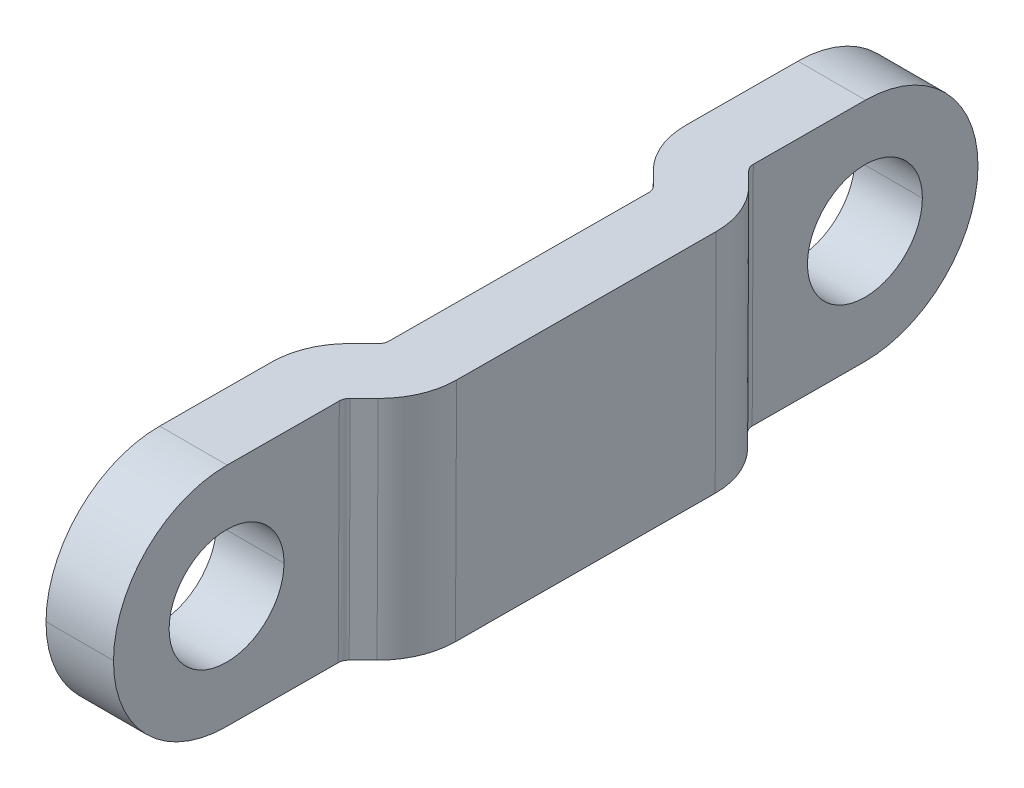
ISO-10303-21;
HEADER;
FILE_DESCRIPTION(('STEP AP214'),'2;1');
FILE_NAME('part.step','',(''),(''),'','','');
FILE_SCHEMA(('AUTOMOTIVE_DESIGN { 1 0 10303 214 1 1 1 1 }'));
ENDSEC;
DATA;
#1=APPLICATION_CONTEXT('core data for automotive mechanical design processes');
#2=APPLICATION_PROTOCOL_DEFINITION('international standard','automotive_design',2000,#1);
#3=PRODUCT_CONTEXT('',#1,'mechanical');
#4=PRODUCT('Part','Part','',(#3));
#5=PRODUCT_RELATED_PRODUCT_CATEGORY('part','',(#4));
#6=PRODUCT_DEFINITION_FORMATION('','',#4);
#7=PRODUCT_DEFINITION_CONTEXT('part definition',#1,'design');
#8=PRODUCT_DEFINITION('design','',#6,#7);
#9=PRODUCT_DEFINITION_SHAPE('','',#8);
#10=(LENGTH_UNIT() NAMED_UNIT(*) SI_UNIT(.MILLI.,.METRE.));
#11=(NAMED_UNIT(*) PLANE_ANGLE_UNIT() SI_UNIT($,.RADIAN.));
#12=(NAMED_UNIT(*) SI_UNIT($,.STERADIAN.) SOLID_ANGLE_UNIT());
#13=UNCERTAINTY_MEASURE_WITH_UNIT(LENGTH_MEASURE(1.E-05),#10,'distance_accuracy_value','');
#14=(GEOMETRIC_REPRESENTATION_CONTEXT(3) GLOBAL_UNCERTAINTY_ASSIGNED_CONTEXT((#13)) GLOBAL_UNIT_ASSIGNED_CONTEXT((#10,
#11,#12)) REPRESENTATION_CONTEXT('',''));
#15=CARTESIAN_POINT('',(0.,0.,0.));
#16=DIRECTION('',(0.,0.,1.));
#17=DIRECTION('',(1.,0.,0.));
#18=AXIS2_PLACEMENT_3D('',#15,#16,#17);
#19=CARTESIAN_POINT('',(13.3985,7.69566808738572,33.1730499954914));
#20=DIRECTION('',(0.,-0.999988166260955,0.00486490884316564));
#21=DIRECTION('',(-1.,0.,0.));
#22=AXIS2_PLACEMENT_3D('',#19,#20,#21);
#23=CYLINDRICAL_SURFACE('',#22,5.461);
#24=DIRECTION('',(0.,0.999988166260955,-0.00486490884316548));
#25=VECTOR('',#24,1.);
#26=CARTESIAN_POINT('',(9.53698986794027,-8.03335966010237,37.1111270159101));
#27=LINE('',#26,#25);
#28=CARTESIAN_POINT('',(9.53698986794024,-8.03335966010237,37.1111270159101));
#29=VERTEX_POINT('',#28);
#30=CARTESIAN_POINT('',(9.53698986794027,7.71445398217515,37.034514431448));
#31=VERTEX_POINT('',#30);
#32=EDGE_CURVE('E11',#29,#31,#27,.T.);
#33=ORIENTED_EDGE('',*,*,#32,.T.);
#34=CARTESIAN_POINT('',(13.3985,7.69566808738572,33.1730499954914));
#35=DIRECTION('',(0.,0.999988166260955,-0.00486490884316564));
#36=DIRECTION('',(-1.,0.,0.));
#37=AXIS2_PLACEMENT_3D('',#34,#35,#36);
#38=CIRCLE('',#37,5.461);
#39=CARTESIAN_POINT('',(7.9375,7.69566808738571,33.1730499954915));
#40=VERTEX_POINT('',#39);
#41=EDGE_CURVE('E315',#40,#31,#38,.T.);
#42=ORIENTED_EDGE('',*,*,#41,.F.);
#43=DIRECTION('',(0.,-0.999988166260955,0.00486490884316592));
#44=VECTOR('',#43,1.);
#45=CARTESIAN_POINT('',(7.93750000000001,7.69566808738572,33.1730499954914));
#46=LINE('',#45,#44);
#47=CARTESIAN_POINT('',(7.9375,-8.0521455548918,33.2496625799536));
#48=VERTEX_POINT('',#47);
#49=EDGE_CURVE('E261',#40,#48,#46,.T.);
#50=ORIENTED_EDGE('',*,*,#49,.T.);
#51=CARTESIAN_POINT('',(13.3985,-8.05214555489179,33.2496625799536));
#52=DIRECTION('',(0.,-0.999988166260955,0.00486490884316564));
#53=DIRECTION('',(-0.707106781186565,0.00344001003285669,0.707098413469405));
#54=AXIS2_PLACEMENT_3D('',#51,#52,#53);
#55=CIRCLE('',#54,5.461);
#56=EDGE_CURVE('E217',#29,#48,#55,.T.);
#57=ORIENTED_EDGE('',*,*,#56,.F.);
#58=EDGE_LOOP('',(#33,#42,#50,#57));
#59=FACE_BOUND('',#58,.T.);
#60=ADVANCED_FACE('F17',(#59),#23,.T.);
#61=CARTESIAN_POINT('',(9.53698986794027,7.71445398217515,37.034514431448));
#62=DIRECTION('',(0.707106781186548,-0.00344001003285683,-0.707098413469422));
#63=DIRECTION('',(-0.707106781186548,-0.00344001003285683,-0.707098413469422));
#64=AXIS2_PLACEMENT_3D('',#61,#62,#63);
#65=PLANE('',#64);
#66=DIRECTION('',(0.,-0.999988166260955,0.00486490884316592));
#67=VECTOR('',#66,1.);
#68=CARTESIAN_POINT('',(10.5083153672642,7.7191793921864,38.0058284363594));
#69=LINE('',#68,#67);
#70=CARTESIAN_POINT('',(10.5083153672641,7.7191793921864,38.0058284363593));
#71=VERTEX_POINT('',#70);
#72=CARTESIAN_POINT('',(10.5083153672641,-8.02863425009112,38.0824410208215));
#73=VERTEX_POINT('',#72);
#74=EDGE_CURVE('E24',#71,#73,#69,.T.);
#75=ORIENTED_EDGE('',*,*,#74,.F.);
#76=DIRECTION('',(0.707106781186549,0.00344001003285638,0.707098413469421));
#77=VECTOR('',#76,1.);
#78=CARTESIAN_POINT('',(9.53698986794027,7.71445398217515,37.034514431448));
#79=LINE('',#78,#77);
#80=EDGE_CURVE('E312',#31,#71,#79,.T.);
#81=ORIENTED_EDGE('',*,*,#80,.F.);
#82=ORIENTED_EDGE('',*,*,#32,.F.);
#83=DIRECTION('',(-0.707106781186549,-0.00344001003285672,-0.707098413469421));
#84=VECTOR('',#83,1.);
#85=CARTESIAN_POINT('',(10.5083153672641,-8.02863425009112,38.0824410208214));
#86=LINE('',#85,#84);
#87=EDGE_CURVE('E220',#73,#29,#86,.T.);
#88=ORIENTED_EDGE('',*,*,#87,.F.);
#89=EDGE_LOOP('',(#75,#81,#82,#88));
#90=FACE_BOUND('',#89,.T.);
#91=ADVANCED_FACE('F405',(#90),#65,.F.);
#92=CARTESIAN_POINT('',(9.96950000000001,7.72180067983144,38.5446374274231));
#93=DIRECTION('',(0.,-0.999988166260955,0.00486490884316564));
#94=DIRECTION('',(-1.,0.,0.));
#95=AXIS2_PLACEMENT_3D('',#92,#93,#94);
#96=CYLINDRICAL_SURFACE('',#95,0.762000000000002);
#97=DIRECTION('',(0.,0.999988166260955,-0.00486490884316592));
#98=VECTOR('',#97,1.);
#99=CARTESIAN_POINT('',(10.7315,-8.02601296244607,38.6212500118852));
#100=LINE('',#99,#98);
#101=CARTESIAN_POINT('',(10.7315,-8.02601296244608,38.6212500118852));
#102=VERTEX_POINT('',#101);
#103=CARTESIAN_POINT('',(10.7315,7.72180067983144,38.544637427423));
#104=VERTEX_POINT('',#103);
#105=EDGE_CURVE('E387',#102,#104,#100,.T.);
#106=ORIENTED_EDGE('',*,*,#105,.T.);
#107=CARTESIAN_POINT('',(9.96950000000001,7.72180067983144,38.5446374274231));
#108=DIRECTION('',(0.,-0.999988166260955,0.00486490884316564));
#109=DIRECTION('',(0.707106781186434,-0.00344001003285763,-0.707098413469536));
#110=AXIS2_PLACEMENT_3D('',#107,#108,#109);
#111=CIRCLE('',#110,0.762000000000002);
#112=EDGE_CURVE('E309',#71,#104,#111,.T.);
#113=ORIENTED_EDGE('',*,*,#112,.F.);
#114=ORIENTED_EDGE('',*,*,#74,.T.);
#115=CARTESIAN_POINT('',(9.96950000000001,-8.02601296244607,38.6212500118852));
#116=DIRECTION('',(0.,0.999988166260955,-0.00486490884316564));
#117=DIRECTION('',(1.,0.,-1.0927391974657E-13));
#118=AXIS2_PLACEMENT_3D('',#115,#116,#117);
#119=CIRCLE('',#118,0.762000000000002);
#120=EDGE_CURVE('E223',#102,#73,#119,.T.);
#121=ORIENTED_EDGE('',*,*,#120,.F.);
#122=EDGE_LOOP('',(#106,#113,#114,#121));
#123=FACE_BOUND('',#122,.T.);
#124=ADVANCED_FACE('F409',(#123),#96,.F.);
#125=CARTESIAN_POINT('',(10.7315,7.72180067983144,38.5446374274231));
#126=DIRECTION('',(1.,0.,0.));
#127=DIRECTION('',(0.,-0.00486490884316564,-0.999988166260955));
#128=AXIS2_PLACEMENT_3D('',#125,#126,#127);
#129=PLANE('',#128);
#130=DIRECTION('',(0.,-0.999988166260955,0.00486490884316548));
#131=VECTOR('',#130,1.);
#132=CARTESIAN_POINT('',(10.7315,7.80976776436737,56.6263829219943));
#133=LINE('',#132,#131);
#134=CARTESIAN_POINT('',(10.7315,7.80976776436737,56.6263829219943));
#135=VERTEX_POINT('',#134);
#136=CARTESIAN_POINT('',(10.7315,-7.93804587791015,56.7029955064565));
#137=VERTEX_POINT('',#136);
#138=EDGE_CURVE('E39',#135,#137,#133,.T.);
#139=ORIENTED_EDGE('',*,*,#138,.F.);
#140=DIRECTION('',(0.,-0.00486490884316565,-0.999988166260955));
#141=VECTOR('',#140,1.);
#142=CARTESIAN_POINT('',(10.7315,7.80976776436737,56.6263829219943));
#143=LINE('',#142,#141);
#144=EDGE_CURVE('E308',#135,#104,#143,.T.);
#145=ORIENTED_EDGE('',*,*,#144,.T.);
#146=ORIENTED_EDGE('',*,*,#105,.F.);
#147=DIRECTION('',(0.,0.00486490884316556,0.999988166260955));
#148=VECTOR('',#147,1.);
#149=CARTESIAN_POINT('',(10.7315,-8.02601296244609,38.6212500118852));
#150=LINE('',#149,#148);
#151=EDGE_CURVE('E226',#102,#137,#150,.T.);
#152=ORIENTED_EDGE('',*,*,#151,.T.);
#153=EDGE_LOOP('',(#139,#145,#146,#152));
#154=FACE_BOUND('',#153,.T.);
#155=ADVANCED_FACE('F488',(#154),#129,.F.);
#156=CARTESIAN_POINT('',(9.9695,7.80976776436737,56.6263829219943));
#157=DIRECTION('',(0.,-0.999988166260955,0.00486490884316564));
#158=DIRECTION('',(-1.,0.,0.));
#159=AXIS2_PLACEMENT_3D('',#156,#157,#158);
#160=CYLINDRICAL_SURFACE('',#159,0.762000000000001);
#161=DIRECTION('',(0.,0.999988166260955,-0.00486490884316548));
#162=VECTOR('',#161,1.);
#163=CARTESIAN_POINT('',(10.5083153672641,-7.93542459026511,57.2418044975202));
#164=LINE('',#163,#162);
#165=CARTESIAN_POINT('',(10.5083153672641,-7.93542459026511,57.2418044975202));
#166=VERTEX_POINT('',#165);
#167=CARTESIAN_POINT('',(10.5083153672641,7.81238905201241,57.165191913058));
#168=VERTEX_POINT('',#167);
#169=EDGE_CURVE('E382',#166,#168,#164,.T.);
#170=ORIENTED_EDGE('',*,*,#169,.T.);
#171=CARTESIAN_POINT('',(9.9695,7.80976776436737,56.6263829219943));
#172=DIRECTION('',(0.,-0.999988166260955,0.00486490884316564));
#173=DIRECTION('',(1.,0.,0.));
#174=AXIS2_PLACEMENT_3D('',#171,#172,#173);
#175=CIRCLE('',#174,0.762000000000001);
#176=EDGE_CURVE('E305',#135,#168,#175,.T.);
#177=ORIENTED_EDGE('',*,*,#176,.F.);
#178=ORIENTED_EDGE('',*,*,#138,.T.);
#179=CARTESIAN_POINT('',(9.9695,-7.93804587791014,56.7029955064565));
#180=DIRECTION('',(0.,0.999988166260955,-0.00486490884316564));
#181=DIRECTION('',(0.707106781186496,0.00344001003285764,0.707098413469473));
#182=AXIS2_PLACEMENT_3D('',#179,#180,#181);
#183=CIRCLE('',#182,0.762000000000001);
#184=EDGE_CURVE('E227',#166,#137,#183,.T.);
#185=ORIENTED_EDGE('',*,*,#184,.F.);
#186=EDGE_LOOP('',(#170,#177,#178,#185));
#187=FACE_BOUND('',#186,.T.);
#188=ADVANCED_FACE('F493',(#187),#160,.F.);
#189=CARTESIAN_POINT('',(10.5083153672642,7.81238905201241,57.165191913058));
#190=DIRECTION('',(0.707106781186547,0.00344001003285683,0.707098413469422));
#191=DIRECTION('',(0.707106781186548,-0.00344001003285683,-0.707098413469422));
#192=AXIS2_PLACEMENT_3D('',#189,#190,#191);
#193=PLANE('',#192);
#194=DIRECTION('',(0.,-0.999988166260955,0.00486490884316592));
#195=VECTOR('',#194,1.);
#196=CARTESIAN_POINT('',(9.53698986794024,7.81711446202366,58.1365059179694));
#197=LINE('',#196,#195);
#198=CARTESIAN_POINT('',(9.53698986794027,7.81711446202366,58.1365059179694));
#199=VERTEX_POINT('',#198);
#200=CARTESIAN_POINT('',(9.53698986794023,-7.93069918025386,58.2131185024316));
#201=VERTEX_POINT('',#200);
#202=EDGE_CURVE('E378',#199,#201,#197,.T.);
#203=ORIENTED_EDGE('',*,*,#202,.F.);
#204=DIRECTION('',(-0.70710678118655,0.00344001003285643,0.70709841346942));
#205=VECTOR('',#204,1.);
#206=CARTESIAN_POINT('',(10.5083153672641,7.81238905201241,57.165191913058));
#207=LINE('',#206,#205);
#208=EDGE_CURVE('E301',#168,#199,#207,.T.);
#209=ORIENTED_EDGE('',*,*,#208,.F.);
#210=ORIENTED_EDGE('',*,*,#169,.F.);
#211=DIRECTION('',(0.70710678118655,-0.00344001003285669,-0.70709841346942));
#212=VECTOR('',#211,1.);
#213=CARTESIAN_POINT('',(9.53698986794021,-7.93069918025386,58.2131185024316));
#214=LINE('',#213,#212);
#215=EDGE_CURVE('E230',#201,#166,#214,.T.);
#216=ORIENTED_EDGE('',*,*,#215,.F.);
#217=EDGE_LOOP('',(#203,#209,#210,#216));
#218=FACE_BOUND('',#217,.T.);
#219=ADVANCED_FACE('F496',(#218),#193,.F.);
#220=CARTESIAN_POINT('',(13.3985,7.83590035681309,61.9979703539259));
#221=DIRECTION('',(0.,-0.999988166260955,0.00486490884316564));
#222=DIRECTION('',(-1.,0.,0.));
#223=AXIS2_PLACEMENT_3D('',#220,#221,#222);
#224=CYLINDRICAL_SURFACE('',#223,5.461);
#225=DIRECTION('',(0.,0.999988166260955,-0.00486490884316548));
#226=VECTOR('',#225,1.);
#227=CARTESIAN_POINT('',(7.9375,-7.91191328546442,62.0745829383881));
#228=LINE('',#227,#226);
#229=CARTESIAN_POINT('',(7.9375,-7.91191328546443,62.0745829383881));
#230=VERTEX_POINT('',#229);
#231=CARTESIAN_POINT('',(7.9375,7.83590035681309,61.9979703539259));
#232=VERTEX_POINT('',#231);
#233=EDGE_CURVE('E383',#230,#232,#228,.T.);
#234=ORIENTED_EDGE('',*,*,#233,.T.);
#235=CARTESIAN_POINT('',(13.3985,7.83590035681309,61.9979703539259));
#236=DIRECTION('',(0.,0.999988166260955,-0.00486490884316564));
#237=DIRECTION('',(-0.707106781186538,-0.00344001003285701,-0.707098413469432));
#238=AXIS2_PLACEMENT_3D('',#235,#236,#237);
#239=CIRCLE('',#238,5.461);
#240=EDGE_CURVE('E298',#199,#232,#239,.T.);
#241=ORIENTED_EDGE('',*,*,#240,.F.);
#242=ORIENTED_EDGE('',*,*,#202,.T.);
#243=CARTESIAN_POINT('',(13.3985,-7.91191328546442,62.0745829383881));
#244=DIRECTION('',(0.,-0.999988166260955,0.00486490884316564));
#245=DIRECTION('',(-1.,0.,0.));
#246=AXIS2_PLACEMENT_3D('',#243,#244,#245);
#247=CIRCLE('',#246,5.461);
#248=EDGE_CURVE('E233',#230,#201,#247,.T.);
#249=ORIENTED_EDGE('',*,*,#248,.F.);
#250=EDGE_LOOP('',(#234,#241,#242,#249));
#251=FACE_BOUND('',#250,.T.);
#252=ADVANCED_FACE('F500',(#251),#224,.T.);
#253=CARTESIAN_POINT('',(7.9375,-0.216245198078713,25.3990794717901));
#254=DIRECTION('',(1.,0.,0.));
#255=DIRECTION('',(0.,-0.00486490884316564,-0.999988166260955));
#256=AXIS2_PLACEMENT_3D('',#253,#254,#255);
#257=CYLINDRICAL_SURFACE('',#256,4.0005);
#258=DIRECTION('',(1.,0.,0.));
#259=VECTOR('',#258,1.);
#260=CARTESIAN_POINT('',(7.9375,-0.196783130251628,29.399532130917));
#261=LINE('',#260,#259);
#262=CARTESIAN_POINT('',(7.9375,-0.196783130251629,29.399532130917));
#263=VERTEX_POINT('',#262);
#264=CARTESIAN_POINT('',(12.6365,-0.196783130251629,29.399532130917));
#265=VERTEX_POINT('',#264);
#266=EDGE_CURVE('E375',#263,#265,#261,.T.);
#267=ORIENTED_EDGE('',*,*,#266,.T.);
#268=CARTESIAN_POINT('',(12.6365,-0.216245198078713,25.3990794717901));
#269=DIRECTION('',(-1.,0.,0.));
#270=DIRECTION('',(0.,-0.00486490884316595,-0.999988166260955));
#271=AXIS2_PLACEMENT_3D('',#268,#269,#270);
#272=CIRCLE('',#271,4.0005);
#273=CARTESIAN_POINT('',(12.6365,-0.235707265905798,21.3986268126631));
#274=VERTEX_POINT('',#273);
#275=EDGE_CURVE('E333',#274,#265,#272,.T.);
#276=ORIENTED_EDGE('',*,*,#275,.F.);
#277=DIRECTION('',(-1.,0.,0.));
#278=VECTOR('',#277,1.);
#279=CARTESIAN_POINT('',(12.6365,-0.235707265905798,21.3986268126631));
#280=LINE('',#279,#278);
#281=CARTESIAN_POINT('',(7.9375,-0.235707265905798,21.3986268126631));
#282=VERTEX_POINT('',#281);
#283=EDGE_CURVE('E376',#274,#282,#280,.T.);
#284=ORIENTED_EDGE('',*,*,#283,.T.);
#285=CARTESIAN_POINT('',(7.9375,-0.216245198078713,25.3990794717901));
#286=DIRECTION('',(1.,0.,0.));
#287=DIRECTION('',(0.,0.00486490884316516,0.999988166260955));
#288=AXIS2_PLACEMENT_3D('',#285,#286,#287);
#289=CIRCLE('',#288,4.0005);
#290=EDGE_CURVE('E274',#263,#282,#289,.T.);
#291=ORIENTED_EDGE('',*,*,#290,.F.);
#292=EDGE_LOOP('',(#267,#276,#284,#291));
#293=FACE_BOUND('',#292,.T.);
#294=ADVANCED_FACE('F504',(#293),#257,.F.);
#295=CARTESIAN_POINT('',(7.9375,-0.216245198078713,25.3990794717901));
#296=DIRECTION('',(1.,0.,0.));
#297=DIRECTION('',(0.,-0.00486490884316564,-0.999988166260955));
#298=AXIS2_PLACEMENT_3D('',#295,#296,#297);
#299=CYLINDRICAL_SURFACE('',#298,4.0005);
#300=CARTESIAN_POINT('',(7.9375,-0.216245198078713,25.3990794717901));
#301=DIRECTION('',(1.,0.,0.));
#302=DIRECTION('',(0.,-0.00486490884316595,-0.999988166260955));
#303=AXIS2_PLACEMENT_3D('',#300,#301,#302);
#304=CIRCLE('',#303,4.0005);
#305=EDGE_CURVE('E271',#282,#263,#304,.T.);
#306=ORIENTED_EDGE('',*,*,#305,.F.);
#307=ORIENTED_EDGE('',*,*,#283,.F.);
#308=CARTESIAN_POINT('',(12.6365,-0.216245198078713,25.3990794717901));
#309=DIRECTION('',(-1.,0.,0.));
#310=DIRECTION('',(0.,0.00486490884316516,0.999988166260955));
#311=AXIS2_PLACEMENT_3D('',#308,#309,#310);
#312=CIRCLE('',#311,4.0005);
#313=EDGE_CURVE('E330',#265,#274,#312,.T.);
#314=ORIENTED_EDGE('',*,*,#313,.F.);
#315=ORIENTED_EDGE('',*,*,#266,.F.);
#316=EDGE_LOOP('',(#306,#307,#314,#315));
#317=FACE_BOUND('',#316,.T.);
#318=ADVANCED_FACE('F508',(#317),#299,.F.);
#319=CARTESIAN_POINT('',(7.9375,-0.216245198078713,25.39907947179));
#320=DIRECTION('',(1.,0.,0.));
#321=DIRECTION('',(0.,-0.00486490884316564,-0.999988166260955));
#322=AXIS2_PLACEMENT_3D('',#319,#320,#321);
#323=CYLINDRICAL_SURFACE('',#322,7.874);
#324=DIRECTION('',(1.,0.,0.));
#325=VECTOR('',#324,1.);
#326=CARTESIAN_POINT('',(7.9375,-0.254551490309801,17.5251726506513));
#327=LINE('',#326,#325);
#328=CARTESIAN_POINT('',(7.9375,-0.2545514903098,17.5251726506513));
#329=VERTEX_POINT('',#328);
#330=CARTESIAN_POINT('',(12.6365,-0.2545514903098,17.5251726506513));
#331=VERTEX_POINT('',#330);
#332=EDGE_CURVE('E370',#329,#331,#327,.T.);
#333=ORIENTED_EDGE('',*,*,#332,.T.);
#334=CARTESIAN_POINT('',(12.6365,-0.216245198078713,25.39907947179));
#335=DIRECTION('',(1.,0.,0.));
#336=DIRECTION('',(0.,-0.999988166260955,0.00486490884317208));
#337=AXIS2_PLACEMENT_3D('',#334,#335,#336);
#338=CIRCLE('',#337,7.874);
#339=CARTESIAN_POINT('',(12.6365,-8.09015201921747,25.4373857640211));
#340=VERTEX_POINT('',#339);
#341=EDGE_CURVE('E326',#340,#331,#338,.T.);
#342=ORIENTED_EDGE('',*,*,#341,.F.);
#343=DIRECTION('',(-1.,0.,0.));
#344=VECTOR('',#343,1.);
#345=CARTESIAN_POINT('',(12.6365,-8.09015201921747,25.4373857640211));
#346=LINE('',#345,#344);
#347=CARTESIAN_POINT('',(7.9375,-8.09015201921747,25.4373857640211));
#348=VERTEX_POINT('',#347);
#349=EDGE_CURVE('E262',#340,#348,#346,.T.);
#350=ORIENTED_EDGE('',*,*,#349,.T.);
#351=CARTESIAN_POINT('',(7.9375,-0.216245198078713,25.39907947179));
#352=DIRECTION('',(-1.,0.,0.));
#353=DIRECTION('',(0.,-0.00486490884316589,-0.999988166260955));
#354=AXIS2_PLACEMENT_3D('',#351,#352,#353);
#355=CIRCLE('',#354,7.874);
#356=EDGE_CURVE('E265',#329,#348,#355,.T.);
#357=ORIENTED_EDGE('',*,*,#356,.F.);
#358=EDGE_LOOP('',(#333,#342,#350,#357));
#359=FACE_BOUND('',#358,.T.);
#360=ADVANCED_FACE('F421',(#359),#323,.T.);
#361=CARTESIAN_POINT('',(7.9375,-0.216245198078713,25.39907947179));
#362=DIRECTION('',(1.,0.,0.));
#363=DIRECTION('',(0.,-0.00486490884316564,-0.999988166260955));
#364=AXIS2_PLACEMENT_3D('',#361,#362,#363);
#365=CYLINDRICAL_SURFACE('',#364,7.874);
#366=CARTESIAN_POINT('',(7.9375,-0.216245198078713,25.39907947179));
#367=DIRECTION('',(-1.,0.,0.));
#368=DIRECTION('',(0.,0.999988166260955,-0.00486490884316988));
#369=AXIS2_PLACEMENT_3D('',#366,#367,#368);
#370=CIRCLE('',#369,7.874);
#371=CARTESIAN_POINT('',(7.9375,7.65766162306005,25.3607731795589));
#372=VERTEX_POINT('',#371);
#373=EDGE_CURVE('E268',#372,#329,#370,.T.);
#374=ORIENTED_EDGE('',*,*,#373,.F.);
#375=DIRECTION('',(1.,0.,0.));
#376=VECTOR('',#375,1.);
#377=CARTESIAN_POINT('',(7.9375,7.65766162306005,25.360773179559));
#378=LINE('',#377,#376);
#379=CARTESIAN_POINT('',(12.6365,7.65766162306005,25.3607731795589));
#380=VERTEX_POINT('',#379);
#381=EDGE_CURVE('E318',#372,#380,#378,.T.);
#382=ORIENTED_EDGE('',*,*,#381,.T.);
#383=CARTESIAN_POINT('',(12.6365,-0.216245198078713,25.39907947179));
#384=DIRECTION('',(1.,0.,0.));
#385=DIRECTION('',(0.,-0.00486490884316589,-0.999988166260955));
#386=AXIS2_PLACEMENT_3D('',#383,#384,#385);
#387=CIRCLE('',#386,7.874);
#388=EDGE_CURVE('E323',#331,#380,#387,.T.);
#389=ORIENTED_EDGE('',*,*,#388,.F.);
#390=ORIENTED_EDGE('',*,*,#332,.F.);
#391=EDGE_LOOP('',(#374,#382,#389,#390));
#392=FACE_BOUND('',#391,.T.);
#393=ADVANCED_FACE('F418',(#392),#365,.T.);
#394=CARTESIAN_POINT('',(7.9375,0.,69.8485534620895));
#395=DIRECTION('',(1.,0.,0.));
#396=DIRECTION('',(0.,-0.00486490884316564,-0.999988166260955));
#397=AXIS2_PLACEMENT_3D('',#394,#395,#396);
#398=CYLINDRICAL_SURFACE('',#397,4.0005);
#399=CARTESIAN_POINT('',(7.9375,0.,69.8485534620895));
#400=DIRECTION('',(1.,0.,0.));
#401=DIRECTION('',(0.,-0.00486490884316688,-0.999988166260955));
#402=AXIS2_PLACEMENT_3D('',#399,#400,#401);
#403=CIRCLE('',#402,4.0005);
#404=CARTESIAN_POINT('',(7.9375,-0.0194620678270861,65.8481008029626));
#405=VERTEX_POINT('',#404);
#406=CARTESIAN_POINT('',(7.9375,0.0194620678270832,73.8490061212165));
#407=VERTEX_POINT('',#406);
#408=EDGE_CURVE('E192',#405,#407,#403,.T.);
#409=ORIENTED_EDGE('',*,*,#408,.F.);
#410=DIRECTION('',(-1.,0.,0.));
#411=VECTOR('',#410,1.);
#412=CARTESIAN_POINT('',(12.6365,-0.0194620678270851,65.8481008029626));
#413=LINE('',#412,#411);
#414=CARTESIAN_POINT('',(12.6365,-0.0194620678270855,65.8481008029626));
#415=VERTEX_POINT('',#414);
#416=EDGE_CURVE('E212',#415,#405,#413,.T.);
#417=ORIENTED_EDGE('',*,*,#416,.F.);
#418=CARTESIAN_POINT('',(12.6365,0.,69.8485534620895));
#419=DIRECTION('',(-1.,0.,0.));
#420=DIRECTION('',(0.,0.00486490884316469,0.999988166260955));
#421=AXIS2_PLACEMENT_3D('',#418,#419,#420);
#422=CIRCLE('',#421,4.0005);
#423=CARTESIAN_POINT('',(12.6365,0.0194620678270832,73.8490061212165));
#424=VERTEX_POINT('',#423);
#425=EDGE_CURVE('E195',#424,#415,#422,.T.);
#426=ORIENTED_EDGE('',*,*,#425,.F.);
#427=DIRECTION('',(1.,0.,0.));
#428=VECTOR('',#427,1.);
#429=CARTESIAN_POINT('',(7.9375,0.0194620678270847,73.8490061212165));
#430=LINE('',#429,#428);
#431=EDGE_CURVE('E189',#407,#424,#430,.T.);
#432=ORIENTED_EDGE('',*,*,#431,.F.);
#433=EDGE_LOOP('',(#409,#417,#426,#432));
#434=FACE_BOUND('',#433,.T.);
#435=ADVANCED_FACE('F191',(#434),#398,.F.);
#436=CARTESIAN_POINT('',(7.9375,0.,69.8485534620895));
#437=DIRECTION('',(-1.,0.,0.));
#438=DIRECTION('',(0.,0.00486490884316564,0.999988166260955));
#439=AXIS2_PLACEMENT_3D('',#436,#437,#438);
#440=CYLINDRICAL_SURFACE('',#439,7.874);
#441=CARTESIAN_POINT('',(12.6365,0.,69.8485534620895));
#442=DIRECTION('',(1.,0.,0.));
#443=DIRECTION('',(0.,0.999988166260955,-0.00486490884316944));
#444=AXIS2_PLACEMENT_3D('',#441,#442,#443);
#445=CIRCLE('',#444,7.874);
#446=CARTESIAN_POINT('',(12.6365,7.87390682113876,69.8102471698584));
#447=VERTEX_POINT('',#446);
#448=CARTESIAN_POINT('',(12.6365,0.0383062922310863,77.7224602832283));
#449=VERTEX_POINT('',#448);
#450=EDGE_CURVE('E361',#447,#449,#445,.T.);
#451=ORIENTED_EDGE('',*,*,#450,.F.);
#452=DIRECTION('',(-1.,0.,0.));
#453=VECTOR('',#452,1.);
#454=CARTESIAN_POINT('',(12.6365,7.87390682113876,69.8102471698584));
#455=LINE('',#454,#453);
#456=CARTESIAN_POINT('',(7.9375,7.87390682113876,69.8102471698584));
#457=VERTEX_POINT('',#456);
#458=EDGE_CURVE('E302',#447,#457,#455,.T.);
#459=ORIENTED_EDGE('',*,*,#458,.T.);
#460=CARTESIAN_POINT('',(7.9375,0.,69.8485534620895));
#461=DIRECTION('',(-1.,0.,0.));
#462=DIRECTION('',(0.,0.00486490884316504,0.999988166260955));
#463=AXIS2_PLACEMENT_3D('',#460,#461,#462);
#464=CIRCLE('',#463,7.874);
#465=CARTESIAN_POINT('',(7.9375,0.038306292231084,77.7224602832283));
#466=VERTEX_POINT('',#465);
#467=EDGE_CURVE('E466',#466,#457,#464,.T.);
#468=ORIENTED_EDGE('',*,*,#467,.F.);
#469=DIRECTION('',(-1.,0.,0.));
#470=VECTOR('',#469,1.);
#471=CARTESIAN_POINT('',(12.6365,0.0383062922310843,77.7224602832283));
#472=LINE('',#471,#470);
#473=EDGE_CURVE('E365',#449,#466,#472,.T.);
#474=ORIENTED_EDGE('',*,*,#473,.F.);
#475=EDGE_LOOP('',(#451,#459,#468,#474));
#476=FACE_BOUND('',#475,.T.);
#477=ADVANCED_FACE('F469',(#476),#440,.T.);
#478=CARTESIAN_POINT('',(7.9375,0.,69.8485534620895));
#479=DIRECTION('',(-1.,0.,0.));
#480=DIRECTION('',(0.,0.00486490884316564,0.999988166260955));
#481=AXIS2_PLACEMENT_3D('',#478,#479,#480);
#482=CYLINDRICAL_SURFACE('',#481,7.874);
#483=ORIENTED_EDGE('',*,*,#473,.T.);
#484=CARTESIAN_POINT('',(7.9375,0.,69.8485534620895));
#485=DIRECTION('',(-1.,0.,0.));
#486=DIRECTION('',(0.,-0.999988166260955,0.00486490884316591));
#487=AXIS2_PLACEMENT_3D('',#484,#485,#486);
#488=CIRCLE('',#487,7.874);
#489=CARTESIAN_POINT('',(7.9375,-7.87390682113876,69.8868597543206));
#490=VERTEX_POINT('',#489);
#491=EDGE_CURVE('E209',#490,#466,#488,.T.);
#492=ORIENTED_EDGE('',*,*,#491,.F.);
#493=DIRECTION('',(1.,0.,0.));
#494=VECTOR('',#493,1.);
#495=CARTESIAN_POINT('',(7.9375,-7.87390682113876,69.8868597543206));
#496=LINE('',#495,#494);
#497=CARTESIAN_POINT('',(12.6365,-7.87390682113876,69.8868597543206));
#498=VERTEX_POINT('',#497);
#499=EDGE_CURVE('E236',#490,#498,#496,.T.);
#500=ORIENTED_EDGE('',*,*,#499,.T.);
#501=CARTESIAN_POINT('',(12.6365,0.,69.8485534620895));
#502=DIRECTION('',(1.,0.,0.));
#503=DIRECTION('',(0.,0.00486490884316592,0.999988166260955));
#504=AXIS2_PLACEMENT_3D('',#501,#502,#503);
#505=CIRCLE('',#504,7.874);
#506=EDGE_CURVE('E354',#449,#498,#505,.T.);
#507=ORIENTED_EDGE('',*,*,#506,.F.);
#508=EDGE_LOOP('',(#483,#492,#500,#507));
#509=FACE_BOUND('',#508,.T.);
#510=ADVANCED_FACE('F470',(#509),#482,.T.);
#511=CARTESIAN_POINT('',(12.6365,7.83590035681309,61.9979703539259));
#512=DIRECTION('',(1.,0.,0.));
#513=DIRECTION('',(0.,-0.00486490884316564,-0.999988166260955));
#514=AXIS2_PLACEMENT_3D('',#511,#512,#513);
#515=PLANE('',#514);
#516=CARTESIAN_POINT('',(12.6365,0.,69.8485534620895));
#517=DIRECTION('',(-1.,0.,0.));
#518=DIRECTION('',(0.,-0.00486490884316645,-0.999988166260955));
#519=AXIS2_PLACEMENT_3D('',#516,#517,#518);
#520=CIRCLE('',#519,4.0005);
#521=EDGE_CURVE('E201',#415,#424,#520,.T.);
#522=ORIENTED_EDGE('',*,*,#521,.T.);
#523=ORIENTED_EDGE('',*,*,#425,.T.);
#524=EDGE_LOOP('',(#522,#523));
#525=FACE_BOUND('',#524,.T.);
#526=ORIENTED_EDGE('',*,*,#450,.T.);
#527=ORIENTED_EDGE('',*,*,#506,.T.);
#528=DIRECTION('',(0.,-0.0048649088431656,-0.999988166260955));
#529=VECTOR('',#528,1.);
#530=CARTESIAN_POINT('',(12.6365,-7.87390682113877,69.8868597543206));
#531=LINE('',#530,#529);
#532=CARTESIAN_POINT('',(12.6365,-7.91191328546443,62.0745829383881));
#533=VERTEX_POINT('',#532);
#534=EDGE_CURVE('E241',#498,#533,#531,.T.);
#535=ORIENTED_EDGE('',*,*,#534,.T.);
#536=DIRECTION('',(0.,-0.999988166260955,0.00486490884316548));
#537=VECTOR('',#536,1.);
#538=CARTESIAN_POINT('',(12.6365,7.83590035681309,61.9979703539259));
#539=LINE('',#538,#537);
#540=CARTESIAN_POINT('',(12.6365,7.83590035681309,61.9979703539259));
#541=VERTEX_POINT('',#540);
#542=EDGE_CURVE('E351',#541,#533,#539,.T.);
#543=ORIENTED_EDGE('',*,*,#542,.F.);
#544=DIRECTION('',(0.,0.00486490884316561,0.999988166260955));
#545=VECTOR('',#544,1.);
#546=CARTESIAN_POINT('',(12.6365,7.83590035681309,61.9979703539259));
#547=LINE('',#546,#545);
#548=EDGE_CURVE('E297',#541,#447,#547,.T.);
#549=ORIENTED_EDGE('',*,*,#548,.T.);
#550=EDGE_LOOP('',(#526,#527,#535,#543,#549));
#551=FACE_BOUND('',#550,.T.);
#552=ADVANCED_FACE('F452',(#525,#551),#515,.T.);
#553=CARTESIAN_POINT('',(13.3985,7.83590035681309,61.9979703539259));
#554=DIRECTION('',(0.,-0.999988166260955,0.00486490884316564));
#555=DIRECTION('',(-1.,0.,0.));
#556=AXIS2_PLACEMENT_3D('',#553,#554,#555);
#557=CYLINDRICAL_SURFACE('',#556,0.761999999999998);
#558=DIRECTION('',(0.,0.999988166260955,-0.00486490884316592));
#559=VECTOR('',#558,1.);
#560=CARTESIAN_POINT('',(12.8596846327359,-7.91453457310946,61.5357739473244));
#561=LINE('',#560,#559);
#562=CARTESIAN_POINT('',(12.8596846327358,-7.91453457310946,61.5357739473244));
#563=VERTEX_POINT('',#562);
#564=CARTESIAN_POINT('',(12.8596846327358,7.83327906916805,61.4591613628622));
#565=VERTEX_POINT('',#564);
#566=EDGE_CURVE('E349',#563,#565,#561,.T.);
#567=ORIENTED_EDGE('',*,*,#566,.T.);
#568=CARTESIAN_POINT('',(13.3985,7.83590035681309,61.9979703539259));
#569=DIRECTION('',(0.,-0.999988166260955,0.00486490884316564));
#570=DIRECTION('',(-1.,0.,0.));
#571=AXIS2_PLACEMENT_3D('',#568,#569,#570);
#572=CIRCLE('',#571,0.761999999999998);
#573=EDGE_CURVE('E294',#541,#565,#572,.T.);
#574=ORIENTED_EDGE('',*,*,#573,.F.);
#575=ORIENTED_EDGE('',*,*,#542,.T.);
#576=CARTESIAN_POINT('',(13.3985,-7.91191328546442,62.0745829383881));
#577=DIRECTION('',(0.,0.999988166260955,-0.00486490884316564));
#578=DIRECTION('',(-0.707106781186702,-0.00344001003285538,-0.707098413469267));
#579=AXIS2_PLACEMENT_3D('',#576,#577,#578);
#580=CIRCLE('',#579,0.761999999999998);
#581=EDGE_CURVE('E237',#563,#533,#580,.T.);
#582=ORIENTED_EDGE('',*,*,#581,.F.);
#583=EDGE_LOOP('',(#567,#574,#575,#582));
#584=FACE_BOUND('',#583,.T.);
#585=ADVANCED_FACE('F449',(#584),#557,.F.);
#586=CARTESIAN_POINT('',(13.8310101320597,7.8285536591568,60.4878473579508));
#587=DIRECTION('',(0.707106781186547,0.00344001003285683,0.707098413469422));
#588=DIRECTION('',(0.707106781186548,-0.00344001003285683,-0.707098413469422));
#589=AXIS2_PLACEMENT_3D('',#586,#587,#588);
#590=PLANE('',#589);
#591=DIRECTION('',(0.,-0.999988166260955,0.00486490884316592));
#592=VECTOR('',#591,1.);
#593=CARTESIAN_POINT('',(13.8310101320597,7.8285536591568,60.4878473579508));
#594=LINE('',#593,#592);
#595=CARTESIAN_POINT('',(13.8310101320597,7.8285536591568,60.4878473579509));
#596=VERTEX_POINT('',#595);
#597=CARTESIAN_POINT('',(13.8310101320597,-7.91925998312072,60.564459942413));
#598=VERTEX_POINT('',#597);
#599=EDGE_CURVE('E346',#596,#598,#594,.T.);
#600=ORIENTED_EDGE('',*,*,#599,.F.);
#601=DIRECTION('',(0.707106781186545,-0.0034400100328569,-0.707098413469424));
#602=VECTOR('',#601,1.);
#603=CARTESIAN_POINT('',(12.8596846327358,7.83327906916806,61.4591613628623));
#604=LINE('',#603,#602);
#605=EDGE_CURVE('E291',#565,#596,#604,.T.);
#606=ORIENTED_EDGE('',*,*,#605,.F.);
#607=ORIENTED_EDGE('',*,*,#566,.F.);
#608=DIRECTION('',(-0.707106781186545,0.00344001003285673,0.707098413469424));
#609=VECTOR('',#608,1.);
#610=CARTESIAN_POINT('',(13.8310101320596,-7.91925998312072,60.5644599424131));
#611=LINE('',#610,#609);
#612=EDGE_CURVE('E240',#598,#563,#611,.T.);
#613=ORIENTED_EDGE('',*,*,#612,.F.);
#614=EDGE_LOOP('',(#600,#606,#607,#613));
#615=FACE_BOUND('',#614,.T.);
#616=ADVANCED_FACE('F445',(#615),#590,.T.);
#617=CARTESIAN_POINT('',(9.9695,7.80976776436737,56.6263829219943));
#618=DIRECTION('',(0.,-0.999988166260955,0.00486490884316564));
#619=DIRECTION('',(-1.,0.,0.));
#620=AXIS2_PLACEMENT_3D('',#617,#618,#619);
#621=CYLINDRICAL_SURFACE('',#620,5.461);
#622=DIRECTION('',(0.,0.999988166260955,-0.00486490884316548));
#623=VECTOR('',#622,1.);
#624=CARTESIAN_POINT('',(15.4305,-7.93804587791014,56.7029955064565));
#625=LINE('',#624,#623);
#626=CARTESIAN_POINT('',(15.4305,-7.93804587791015,56.7029955064565));
#627=VERTEX_POINT('',#626);
#628=CARTESIAN_POINT('',(15.4305,7.80976776436737,56.6263829219943));
#629=VERTEX_POINT('',#628);
#630=EDGE_CURVE('E342',#627,#629,#625,.T.);
#631=ORIENTED_EDGE('',*,*,#630,.T.);
#632=CARTESIAN_POINT('',(9.9695,7.80976776436737,56.6263829219943));
#633=DIRECTION('',(0.,0.999988166260955,-0.00486490884316564));
#634=DIRECTION('',(0.707106781186527,0.00344001003285701,0.707098413469443));
#635=AXIS2_PLACEMENT_3D('',#632,#633,#634);
#636=CIRCLE('',#635,5.461);
#637=EDGE_CURVE('E288',#596,#629,#636,.T.);
#638=ORIENTED_EDGE('',*,*,#637,.F.);
#639=ORIENTED_EDGE('',*,*,#599,.T.);
#640=CARTESIAN_POINT('',(9.9695,-7.93804587791014,56.7029955064565));
#641=DIRECTION('',(0.,-0.999988166260955,0.00486490884316564));
#642=DIRECTION('',(1.,0.,0.));
#643=AXIS2_PLACEMENT_3D('',#640,#641,#642);
#644=CIRCLE('',#643,5.461);
#645=EDGE_CURVE('E244',#627,#598,#644,.T.);
#646=ORIENTED_EDGE('',*,*,#645,.F.);
#647=EDGE_LOOP('',(#631,#638,#639,#646));
#648=FACE_BOUND('',#647,.T.);
#649=ADVANCED_FACE('F441',(#648),#621,.T.);
#650=CARTESIAN_POINT('',(15.4305,7.72180067983144,38.5446374274231));
#651=DIRECTION('',(1.,0.,0.));
#652=DIRECTION('',(0.,-0.00486490884316564,-0.999988166260955));
#653=AXIS2_PLACEMENT_3D('',#650,#651,#652);
#654=PLANE('',#653);
#655=DIRECTION('',(0.,-0.999988166260955,0.00486490884316548));
#656=VECTOR('',#655,1.);
#657=CARTESIAN_POINT('',(15.4305,7.72180067983144,38.544637427423));
#658=LINE('',#657,#656);
#659=CARTESIAN_POINT('',(15.4305,7.72180067983144,38.544637427423));
#660=VERTEX_POINT('',#659);
#661=CARTESIAN_POINT('',(15.4305,-8.02601296244608,38.6212500118852));
#662=VERTEX_POINT('',#661);
#663=EDGE_CURVE('E31',#660,#662,#658,.T.);
#664=ORIENTED_EDGE('',*,*,#663,.F.);
#665=DIRECTION('',(0.,0.00486490884316565,0.999988166260955));
#666=VECTOR('',#665,1.);
#667=CARTESIAN_POINT('',(15.4305,7.72180067983144,38.5446374274231));
#668=LINE('',#667,#666);
#669=EDGE_CURVE('E287',#660,#629,#668,.T.);
#670=ORIENTED_EDGE('',*,*,#669,.T.);
#671=ORIENTED_EDGE('',*,*,#630,.F.);
#672=DIRECTION('',(0.,-0.00486490884316556,-0.999988166260955));
#673=VECTOR('',#672,1.);
#674=CARTESIAN_POINT('',(15.4305,-7.93804587791016,56.7029955064565));
#675=LINE('',#674,#673);
#676=EDGE_CURVE('E247',#627,#662,#675,.T.);
#677=ORIENTED_EDGE('',*,*,#676,.T.);
#678=EDGE_LOOP('',(#664,#670,#671,#677));
#679=FACE_BOUND('',#678,.T.);
#680=ADVANCED_FACE('F439',(#679),#654,.T.);
#681=CARTESIAN_POINT('',(9.96950000000001,7.72180067983144,38.5446374274231));
#682=DIRECTION('',(0.,-0.999988166260955,0.00486490884316564));
#683=DIRECTION('',(-1.,0.,0.));
#684=AXIS2_PLACEMENT_3D('',#681,#682,#683);
#685=CYLINDRICAL_SURFACE('',#684,5.461);
#686=DIRECTION('',(0.,0.999988166260955,-0.00486490884316548));
#687=VECTOR('',#686,1.);
#688=CARTESIAN_POINT('',(13.8310101320597,-8.0447988572355,34.7597855759287));
#689=LINE('',#688,#687);
#690=CARTESIAN_POINT('',(13.8310101320597,-8.04479885723551,34.7597855759287));
#691=VERTEX_POINT('',#690);
#692=CARTESIAN_POINT('',(13.8310101320597,7.70301478504201,34.6831729914665));
#693=VERTEX_POINT('',#692);
#694=EDGE_CURVE('E339',#691,#693,#689,.T.);
#695=ORIENTED_EDGE('',*,*,#694,.T.);
#696=CARTESIAN_POINT('',(9.96950000000001,7.72180067983144,38.5446374274231));
#697=DIRECTION('',(0.,0.999988166260955,-0.00486490884316564));
#698=DIRECTION('',(1.,0.,0.));
#699=AXIS2_PLACEMENT_3D('',#696,#697,#698);
#700=CIRCLE('',#699,5.461);
#701=EDGE_CURVE('E284',#660,#693,#700,.T.);
#702=ORIENTED_EDGE('',*,*,#701,.F.);
#703=ORIENTED_EDGE('',*,*,#663,.T.);
#704=CARTESIAN_POINT('',(9.96950000000001,-8.02601296244607,38.6212500118852));
#705=DIRECTION('',(0.,-0.999988166260955,0.00486490884316564));
#706=DIRECTION('',(0.707106781186546,-0.00344001003285669,-0.707098413469423));
#707=AXIS2_PLACEMENT_3D('',#704,#705,#706);
#708=CIRCLE('',#707,5.461);
#709=EDGE_CURVE('E248',#691,#662,#708,.T.);
#710=ORIENTED_EDGE('',*,*,#709,.F.);
#711=EDGE_LOOP('',(#695,#702,#703,#710));
#712=FACE_BOUND('',#711,.T.);
#713=ADVANCED_FACE('F435',(#712),#685,.T.);
#714=CARTESIAN_POINT('',(12.8596846327359,7.69828937503075,33.7118589865551));
#715=DIRECTION('',(0.707106781186548,-0.00344001003285683,-0.707098413469422));
#716=DIRECTION('',(-0.707106781186548,-0.00344001003285683,-0.707098413469422));
#717=AXIS2_PLACEMENT_3D('',#714,#715,#716);
#718=PLANE('',#717);
#719=DIRECTION('',(0.,-0.999988166260955,0.00486490884316548));
#720=VECTOR('',#719,1.);
#721=CARTESIAN_POINT('',(12.8596846327359,7.69828937503075,33.7118589865551));
#722=LINE('',#721,#720);
#723=CARTESIAN_POINT('',(12.8596846327358,7.69828937503075,33.7118589865551));
#724=VERTEX_POINT('',#723);
#725=CARTESIAN_POINT('',(12.8596846327358,-8.04952426724676,33.7884715710173));
#726=VERTEX_POINT('',#725);
#727=EDGE_CURVE('E336',#724,#726,#722,.T.);
#728=ORIENTED_EDGE('',*,*,#727,.F.);
#729=DIRECTION('',(-0.707106781186545,-0.00344001003285645,-0.707098413469425));
#730=VECTOR('',#729,1.);
#731=CARTESIAN_POINT('',(13.8310101320596,7.703014785042,34.6831729914664));
#732=LINE('',#731,#730);
#733=EDGE_CURVE('E281',#693,#724,#732,.T.);
#734=ORIENTED_EDGE('',*,*,#733,.F.);
#735=ORIENTED_EDGE('',*,*,#694,.F.);
#736=DIRECTION('',(0.707106781186545,0.00344001003285795,0.707098413469424));
#737=VECTOR('',#736,1.);
#738=CARTESIAN_POINT('',(12.8596846327358,-8.04952426724677,33.7884715710173));
#739=LINE('',#738,#737);
#740=EDGE_CURVE('E251',#726,#691,#739,.T.);
#741=ORIENTED_EDGE('',*,*,#740,.F.);
#742=EDGE_LOOP('',(#728,#734,#735,#741));
#743=FACE_BOUND('',#742,.T.);
#744=ADVANCED_FACE('F431',(#743),#718,.T.);
#745=CARTESIAN_POINT('',(13.3985,7.69566808738572,33.1730499954914));
#746=DIRECTION('',(0.,-0.999988166260955,0.00486490884316564));
#747=DIRECTION('',(-1.,0.,0.));
#748=AXIS2_PLACEMENT_3D('',#745,#746,#747);
#749=CYLINDRICAL_SURFACE('',#748,0.761999999999999);
#750=DIRECTION('',(0.,0.999988166260955,-0.00486490884316548));
#751=VECTOR('',#750,1.);
#752=CARTESIAN_POINT('',(12.6365,-8.0521455548918,33.2496625799536));
#753=LINE('',#752,#751);
#754=CARTESIAN_POINT('',(12.6365,-8.0521455548918,33.2496625799536));
#755=VERTEX_POINT('',#754);
#756=CARTESIAN_POINT('',(12.6365,7.69566808738571,33.1730499954914));
#757=VERTEX_POINT('',#756);
#758=EDGE_CURVE('E327',#755,#757,#753,.T.);
#759=ORIENTED_EDGE('',*,*,#758,.T.);
#760=CARTESIAN_POINT('',(13.3985,7.69566808738572,33.1730499954914));
#761=DIRECTION('',(0.,-0.999988166260955,0.00486490884316564));
#762=DIRECTION('',(-0.707106781186584,0.00344001003285651,0.707098413469386));
#763=AXIS2_PLACEMENT_3D('',#760,#761,#762);
#764=CIRCLE('',#763,0.761999999999999);
#765=EDGE_CURVE('E278',#724,#757,#764,.T.);
#766=ORIENTED_EDGE('',*,*,#765,.F.);
#767=ORIENTED_EDGE('',*,*,#727,.T.);
#768=CARTESIAN_POINT('',(13.3985,-8.05214555489179,33.2496625799536));
#769=DIRECTION('',(0.,0.999988166260955,-0.00486490884316564));
#770=DIRECTION('',(-1.,0.,0.));
#771=AXIS2_PLACEMENT_3D('',#768,#769,#770);
#772=CIRCLE('',#771,0.761999999999999);
#773=EDGE_CURVE('E254',#755,#726,#772,.T.);
#774=ORIENTED_EDGE('',*,*,#773,.F.);
#775=EDGE_LOOP('',(#759,#766,#767,#774));
#776=FACE_BOUND('',#775,.T.);
#777=ADVANCED_FACE('F428',(#776),#749,.F.);
#778=CARTESIAN_POINT('',(12.6365,7.69566808738572,33.1730499954914));
#779=DIRECTION('',(1.,0.,0.));
#780=DIRECTION('',(0.,-0.00486490884316564,-0.999988166260955));
#781=AXIS2_PLACEMENT_3D('',#778,#779,#780);
#782=PLANE('',#781);
#783=ORIENTED_EDGE('',*,*,#275,.T.);
#784=ORIENTED_EDGE('',*,*,#313,.T.);
#785=EDGE_LOOP('',(#783,#784));
#786=FACE_BOUND('',#785,.T.);
#787=ORIENTED_EDGE('',*,*,#341,.T.);
#788=ORIENTED_EDGE('',*,*,#388,.T.);
#789=DIRECTION('',(0.,0.00486490884316568,0.999988166260955));
#790=VECTOR('',#789,1.);
#791=CARTESIAN_POINT('',(12.6365,7.65766162306005,25.3607731795589));
#792=LINE('',#791,#790);
#793=EDGE_CURVE('E277',#380,#757,#792,.T.);
#794=ORIENTED_EDGE('',*,*,#793,.T.);
#795=ORIENTED_EDGE('',*,*,#758,.F.);
#796=DIRECTION('',(0.,-0.00486490884316562,-0.999988166260955));
#797=VECTOR('',#796,1.);
#798=CARTESIAN_POINT('',(12.6365,-8.05214555489181,33.2496625799536));
#799=LINE('',#798,#797);
#800=EDGE_CURVE('E257',#755,#340,#799,.T.);
#801=ORIENTED_EDGE('',*,*,#800,.T.);
#802=EDGE_LOOP('',(#787,#788,#794,#795,#801));
#803=FACE_BOUND('',#802,.T.);
#804=ADVANCED_FACE('F425',(#786,#803),#782,.T.);
#805=CARTESIAN_POINT('',(13.3985,7.83590035681309,61.9979703539259));
#806=DIRECTION('',(0.,0.999988166260955,-0.00486490884316564));
#807=DIRECTION('',(1.,0.,0.));
#808=AXIS2_PLACEMENT_3D('',#805,#806,#807);
#809=PLANE('',#808);
#810=ORIENTED_EDGE('',*,*,#381,.F.);
#811=DIRECTION('',(0.,-0.00486490884316568,-0.999988166260955));
#812=VECTOR('',#811,1.);
#813=CARTESIAN_POINT('',(7.9375,7.69566808738572,33.1730499954914));
#814=LINE('',#813,#812);
#815=EDGE_CURVE('E258',#40,#372,#814,.T.);
#816=ORIENTED_EDGE('',*,*,#815,.F.);
#817=ORIENTED_EDGE('',*,*,#41,.T.);
#818=ORIENTED_EDGE('',*,*,#80,.T.);
#819=ORIENTED_EDGE('',*,*,#112,.T.);
#820=ORIENTED_EDGE('',*,*,#144,.F.);
#821=ORIENTED_EDGE('',*,*,#176,.T.);
#822=ORIENTED_EDGE('',*,*,#208,.T.);
#823=ORIENTED_EDGE('',*,*,#240,.T.);
#824=DIRECTION('',(0.,-0.00486490884316561,-0.999988166260955));
#825=VECTOR('',#824,1.);
#826=CARTESIAN_POINT('',(7.9375,7.87390682113876,69.8102471698584));
#827=LINE('',#826,#825);
#828=EDGE_CURVE('E385',#457,#232,#827,.T.);
#829=ORIENTED_EDGE('',*,*,#828,.F.);
#830=ORIENTED_EDGE('',*,*,#458,.F.);
#831=ORIENTED_EDGE('',*,*,#548,.F.);
#832=ORIENTED_EDGE('',*,*,#573,.T.);
#833=ORIENTED_EDGE('',*,*,#605,.T.);
#834=ORIENTED_EDGE('',*,*,#637,.T.);
#835=ORIENTED_EDGE('',*,*,#669,.F.);
#836=ORIENTED_EDGE('',*,*,#701,.T.);
#837=ORIENTED_EDGE('',*,*,#733,.T.);
#838=ORIENTED_EDGE('',*,*,#765,.T.);
#839=ORIENTED_EDGE('',*,*,#793,.F.);
#840=EDGE_LOOP('',(#810,#816,#817,#818,#819,#820,#821,#822,#823,#829,#830,#831,#832,#833,#834,
#835,#836,#837,#838,#839));
#841=FACE_BOUND('',#840,.T.);
#842=ADVANCED_FACE('F414',(#841),#809,.T.);
#843=CARTESIAN_POINT('',(7.9375,7.69566808738572,33.1730499954914));
#844=DIRECTION('',(1.,0.,0.));
#845=DIRECTION('',(0.,-0.00486490884316564,-0.999988166260955));
#846=AXIS2_PLACEMENT_3D('',#843,#844,#845);
#847=PLANE('',#846);
#848=ORIENTED_EDGE('',*,*,#290,.T.);
#849=ORIENTED_EDGE('',*,*,#305,.T.);
#850=EDGE_LOOP('',(#848,#849));
#851=FACE_BOUND('',#850,.T.);
#852=ORIENTED_EDGE('',*,*,#373,.T.);
#853=ORIENTED_EDGE('',*,*,#356,.T.);
#854=DIRECTION('',(0.,0.00486490884316563,0.999988166260955));
#855=VECTOR('',#854,1.);
#856=CARTESIAN_POINT('',(7.9375,-8.09015201921747,25.4373857640212));
#857=LINE('',#856,#855);
#858=EDGE_CURVE('E208',#348,#48,#857,.T.);
#859=ORIENTED_EDGE('',*,*,#858,.T.);
#860=ORIENTED_EDGE('',*,*,#49,.F.);
#861=ORIENTED_EDGE('',*,*,#815,.T.);
#862=EDGE_LOOP('',(#852,#853,#859,#860,#861));
#863=FACE_BOUND('',#862,.T.);
#864=ADVANCED_FACE('F399',(#851,#863),#847,.F.);
#865=CARTESIAN_POINT('',(13.3985,-7.91191328546443,62.0745829383881));
#866=DIRECTION('',(0.,0.999988166260955,-0.00486490884316564));
#867=DIRECTION('',(1.,0.,0.));
#868=AXIS2_PLACEMENT_3D('',#865,#866,#867);
#869=PLANE('',#868);
#870=ORIENTED_EDGE('',*,*,#349,.F.);
#871=ORIENTED_EDGE('',*,*,#800,.F.);
#872=ORIENTED_EDGE('',*,*,#773,.T.);
#873=ORIENTED_EDGE('',*,*,#740,.T.);
#874=ORIENTED_EDGE('',*,*,#709,.T.);
#875=ORIENTED_EDGE('',*,*,#676,.F.);
#876=ORIENTED_EDGE('',*,*,#645,.T.);
#877=ORIENTED_EDGE('',*,*,#612,.T.);
#878=ORIENTED_EDGE('',*,*,#581,.T.);
#879=ORIENTED_EDGE('',*,*,#534,.F.);
#880=ORIENTED_EDGE('',*,*,#499,.F.);
#881=DIRECTION('',(0.,0.0048649088431656,0.999988166260955));
#882=VECTOR('',#881,1.);
#883=CARTESIAN_POINT('',(7.9375,-7.91191328546443,62.0745829383881));
#884=LINE('',#883,#882);
#885=EDGE_CURVE('E200',#230,#490,#884,.T.);
#886=ORIENTED_EDGE('',*,*,#885,.F.);
#887=ORIENTED_EDGE('',*,*,#248,.T.);
#888=ORIENTED_EDGE('',*,*,#215,.T.);
#889=ORIENTED_EDGE('',*,*,#184,.T.);
#890=ORIENTED_EDGE('',*,*,#151,.F.);
#891=ORIENTED_EDGE('',*,*,#120,.T.);
#892=ORIENTED_EDGE('',*,*,#87,.T.);
#893=ORIENTED_EDGE('',*,*,#56,.T.);
#894=ORIENTED_EDGE('',*,*,#858,.F.);
#895=EDGE_LOOP('',(#870,#871,#872,#873,#874,#875,#876,#877,#878,#879,#880,#886,#887,#888,#889,
#890,#891,#892,#893,#894));
#896=FACE_BOUND('',#895,.T.);
#897=ADVANCED_FACE('F402',(#896),#869,.F.);
#898=CARTESIAN_POINT('',(7.9375,7.83590035681309,61.9979703539259));
#899=DIRECTION('',(1.,0.,0.));
#900=DIRECTION('',(0.,-0.00486490884316564,-0.999988166260955));
#901=AXIS2_PLACEMENT_3D('',#898,#899,#900);
#902=PLANE('',#901);
#903=CARTESIAN_POINT('',(7.9375,0.,69.8485534620895));
#904=DIRECTION('',(1.,0.,0.));
#905=DIRECTION('',(0.,0.00486490884316469,0.999988166260955));
#906=AXIS2_PLACEMENT_3D('',#903,#904,#905);
#907=CIRCLE('',#906,4.0005);
#908=EDGE_CURVE('E206',#407,#405,#907,.T.);
#909=ORIENTED_EDGE('',*,*,#908,.T.);
#910=ORIENTED_EDGE('',*,*,#408,.T.);
#911=EDGE_LOOP('',(#909,#910));
#912=FACE_BOUND('',#911,.T.);
#913=ORIENTED_EDGE('',*,*,#491,.T.);
#914=ORIENTED_EDGE('',*,*,#467,.T.);
#915=ORIENTED_EDGE('',*,*,#828,.T.);
#916=ORIENTED_EDGE('',*,*,#233,.F.);
#917=ORIENTED_EDGE('',*,*,#885,.T.);
#918=EDGE_LOOP('',(#913,#914,#915,#916,#917));
#919=FACE_BOUND('',#918,.T.);
#920=ADVANCED_FACE('F204',(#912,#919),#902,.F.);
#921=CARTESIAN_POINT('',(7.9375,0.,69.8485534620895));
#922=DIRECTION('',(1.,0.,0.));
#923=DIRECTION('',(0.,-0.00486490884316564,-0.999988166260955));
#924=AXIS2_PLACEMENT_3D('',#921,#922,#923);
#925=CYLINDRICAL_SURFACE('',#924,4.0005);
#926=ORIENTED_EDGE('',*,*,#431,.T.);
#927=ORIENTED_EDGE('',*,*,#521,.F.);
#928=ORIENTED_EDGE('',*,*,#416,.T.);
#929=ORIENTED_EDGE('',*,*,#908,.F.);
#930=EDGE_LOOP('',(#926,#927,#928,#929));
#931=FACE_BOUND('',#930,.T.);
#932=ADVANCED_FACE('F211',(#931),#925,.F.);
#933=CLOSED_SHELL('',(#60,#91,#124,#155,#188,#219,#252,#294,#318,#360,#393,#435,#477,#510,#552,
#585,#616,#649,#680,#713,#744,#777,#804,#842,#864,#897,#920,#932));
#934=MANIFOLD_SOLID_BREP('B1',#933);
#935=ADVANCED_BREP_SHAPE_REPRESENTATION('',(#18,#934),#14);
#936=SHAPE_DEFINITION_REPRESENTATION(#9,#935);
ENDSEC;
END-ISO-10303-21;
